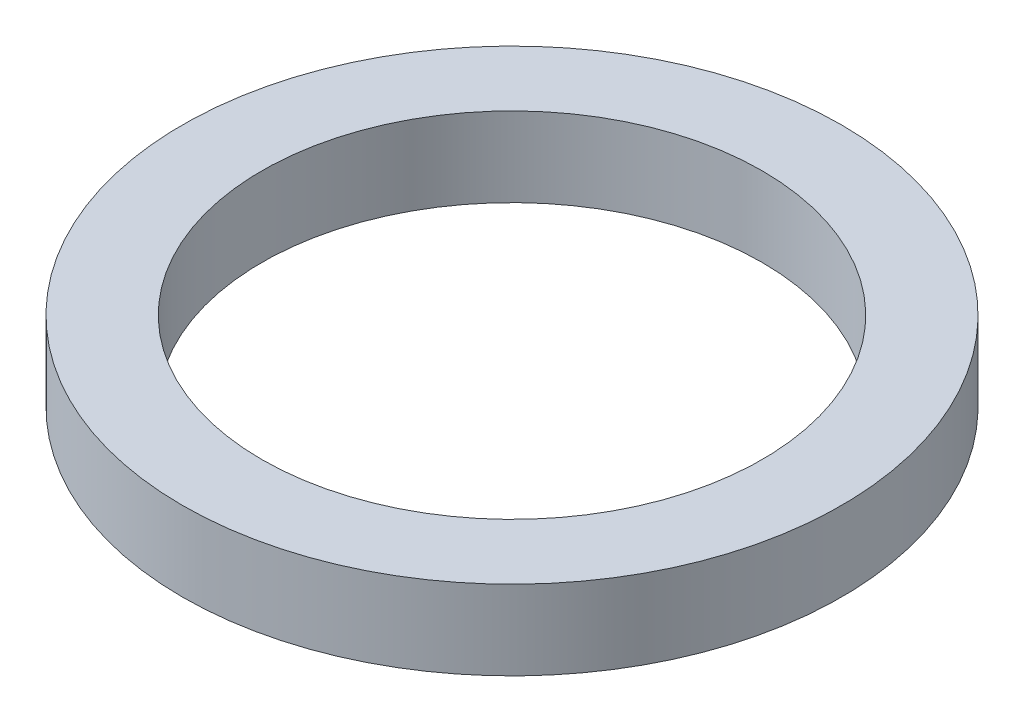
ISO-10303-21;
HEADER;
FILE_DESCRIPTION(('STEP AP214'),'2;1');
FILE_NAME('part.step','',(''),(''),'','','');
FILE_SCHEMA(('AUTOMOTIVE_DESIGN { 1 0 10303 214 1 1 1 1 }'));
ENDSEC;
DATA;
#1=APPLICATION_CONTEXT('core data for automotive mechanical design processes');
#2=APPLICATION_PROTOCOL_DEFINITION('international standard','automotive_design',2000,#1);
#3=PRODUCT_CONTEXT('',#1,'mechanical');
#4=PRODUCT('Part','Part','',(#3));
#5=PRODUCT_RELATED_PRODUCT_CATEGORY('part','',(#4));
#6=PRODUCT_DEFINITION_FORMATION('','',#4);
#7=PRODUCT_DEFINITION_CONTEXT('part definition',#1,'design');
#8=PRODUCT_DEFINITION('design','',#6,#7);
#9=PRODUCT_DEFINITION_SHAPE('','',#8);
#10=(LENGTH_UNIT() NAMED_UNIT(*) SI_UNIT(.MILLI.,.METRE.));
#11=(NAMED_UNIT(*) PLANE_ANGLE_UNIT() SI_UNIT($,.RADIAN.));
#12=(NAMED_UNIT(*) SI_UNIT($,.STERADIAN.) SOLID_ANGLE_UNIT());
#13=UNCERTAINTY_MEASURE_WITH_UNIT(LENGTH_MEASURE(1.E-05),#10,'distance_accuracy_value','');
#14=(GEOMETRIC_REPRESENTATION_CONTEXT(3) GLOBAL_UNCERTAINTY_ASSIGNED_CONTEXT((#13)) GLOBAL_UNIT_ASSIGNED_CONTEXT((#10,
#11,#12)) REPRESENTATION_CONTEXT('',''));
#15=CARTESIAN_POINT('',(0.,0.,0.));
#16=DIRECTION('',(0.,0.,1.));
#17=DIRECTION('',(1.,0.,0.));
#18=AXIS2_PLACEMENT_3D('',#15,#16,#17);
#19=CARTESIAN_POINT('',(0.,1.27,0.));
#20=DIRECTION('',(0.,1.,0.));
#21=DIRECTION('',(0.,0.,1.));
#22=AXIS2_PLACEMENT_3D('',#19,#20,#21);
#23=PLANE('',#22);
#24=CARTESIAN_POINT('',(0.,1.27,0.));
#25=DIRECTION('',(0.,1.,0.));
#26=DIRECTION('',(0.,0.,1.));
#27=AXIS2_PLACEMENT_3D('',#24,#25,#26);
#28=CIRCLE('',#27,5.27);
#29=CARTESIAN_POINT('',(0.,1.27,5.27));
#30=VERTEX_POINT('',#29);
#31=EDGE_CURVE('E10',#30,#30,#28,.T.);
#32=ORIENTED_EDGE('',*,*,#31,.T.);
#33=EDGE_LOOP('',(#32));
#34=FACE_BOUND('',#33,.T.);
#35=CARTESIAN_POINT('',(0.,1.27,0.));
#36=DIRECTION('',(0.,1.,0.));
#37=DIRECTION('',(0.,0.,1.));
#38=AXIS2_PLACEMENT_3D('',#35,#36,#37);
#39=CIRCLE('',#38,4.);
#40=CARTESIAN_POINT('',(0.,1.27,4.));
#41=VERTEX_POINT('',#40);
#42=EDGE_CURVE('E50',#41,#41,#39,.T.);
#43=ORIENTED_EDGE('',*,*,#42,.F.);
#44=EDGE_LOOP('',(#43));
#45=FACE_BOUND('',#44,.T.);
#46=ADVANCED_FACE('F39',(#34,#45),#23,.T.);
#47=CARTESIAN_POINT('',(0.,0.,0.));
#48=DIRECTION('',(0.,1.,0.));
#49=DIRECTION('',(0.,0.,1.));
#50=AXIS2_PLACEMENT_3D('',#47,#48,#49);
#51=PLANE('',#50);
#52=CARTESIAN_POINT('',(0.,0.,0.));
#53=DIRECTION('',(0.,1.,0.));
#54=DIRECTION('',(0.,0.,1.));
#55=AXIS2_PLACEMENT_3D('',#52,#53,#54);
#56=CIRCLE('',#55,5.27);
#57=CARTESIAN_POINT('',(0.,0.,5.27));
#58=VERTEX_POINT('',#57);
#59=EDGE_CURVE('E43',#58,#58,#56,.T.);
#60=ORIENTED_EDGE('',*,*,#59,.F.);
#61=EDGE_LOOP('',(#60));
#62=FACE_BOUND('',#61,.T.);
#63=CARTESIAN_POINT('',(0.,0.,0.));
#64=DIRECTION('',(0.,1.,0.));
#65=DIRECTION('',(0.,0.,1.));
#66=AXIS2_PLACEMENT_3D('',#63,#64,#65);
#67=CIRCLE('',#66,4.);
#68=CARTESIAN_POINT('',(0.,0.,4.));
#69=VERTEX_POINT('',#68);
#70=EDGE_CURVE('E52',#69,#69,#67,.T.);
#71=ORIENTED_EDGE('',*,*,#70,.T.);
#72=EDGE_LOOP('',(#71));
#73=FACE_BOUND('',#72,.T.);
#74=ADVANCED_FACE('F62',(#62,#73),#51,.F.);
#75=CARTESIAN_POINT('',(0.,1.27,0.));
#76=DIRECTION('',(0.,-1.,0.));
#77=DIRECTION('',(0.,0.,-1.));
#78=AXIS2_PLACEMENT_3D('',#75,#76,#77);
#79=CYLINDRICAL_SURFACE('',#78,5.27);
#80=ORIENTED_EDGE('',*,*,#31,.F.);
#81=EDGE_LOOP('',(#80));
#82=FACE_BOUND('',#81,.T.);
#83=ORIENTED_EDGE('',*,*,#59,.T.);
#84=EDGE_LOOP('',(#83));
#85=FACE_BOUND('',#84,.T.);
#86=ADVANCED_FACE('F41',(#82,#85),#79,.T.);
#87=CARTESIAN_POINT('',(0.,1.27,0.));
#88=DIRECTION('',(0.,-1.,0.));
#89=DIRECTION('',(0.,0.,-1.));
#90=AXIS2_PLACEMENT_3D('',#87,#88,#89);
#91=CYLINDRICAL_SURFACE('',#90,4.);
#92=ORIENTED_EDGE('',*,*,#42,.T.);
#93=EDGE_LOOP('',(#92));
#94=FACE_BOUND('',#93,.T.);
#95=ORIENTED_EDGE('',*,*,#70,.F.);
#96=EDGE_LOOP('',(#95));
#97=FACE_BOUND('',#96,.T.);
#98=ADVANCED_FACE('F58',(#94,#97),#91,.F.);
#99=CLOSED_SHELL('',(#46,#74,#86,#98));
#100=MANIFOLD_SOLID_BREP('B2',#99);
#101=ADVANCED_BREP_SHAPE_REPRESENTATION('',(#18,#100),#14);
#102=SHAPE_DEFINITION_REPRESENTATION(#9,#101);
ENDSEC;
END-ISO-10303-21;
